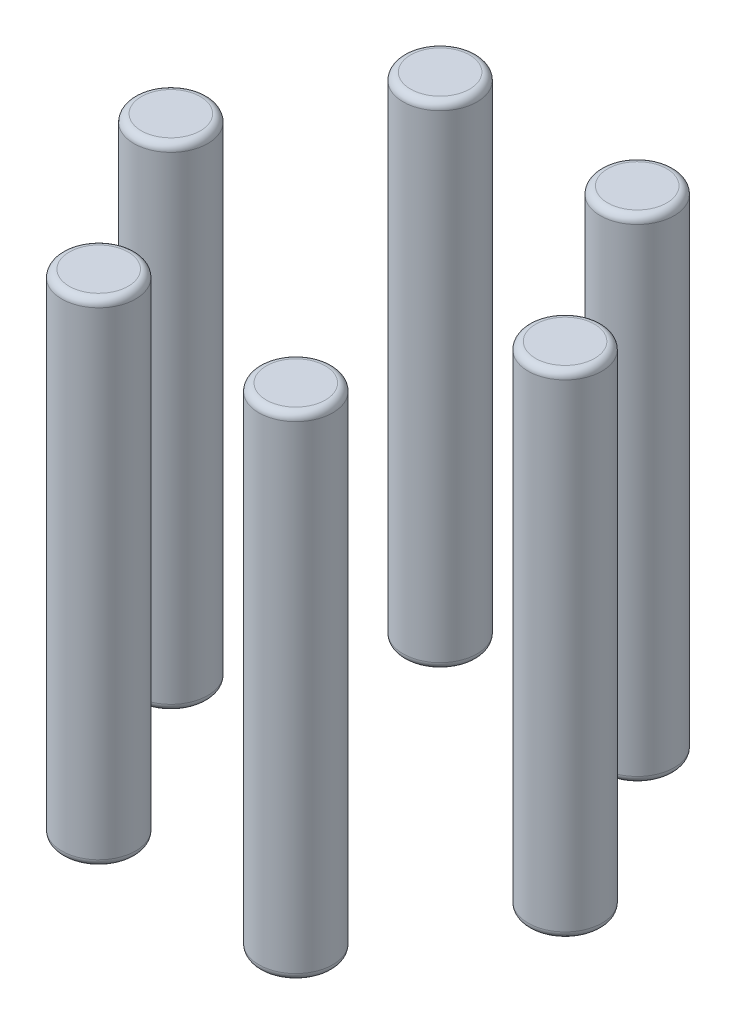
ISO-10303-21;
HEADER;
FILE_DESCRIPTION(('STEP AP214'),'2;1');
FILE_NAME('part.step','',(''),(''),'','','');
FILE_SCHEMA(('AUTOMOTIVE_DESIGN { 1 0 10303 214 1 1 1 1 }'));
ENDSEC;
DATA;
#1=APPLICATION_CONTEXT('core data for automotive mechanical design processes');
#2=APPLICATION_PROTOCOL_DEFINITION('international standard','automotive_design',2000,#1);
#3=PRODUCT_CONTEXT('',#1,'mechanical');
#4=PRODUCT('Part','Part','',(#3));
#5=PRODUCT_RELATED_PRODUCT_CATEGORY('part','',(#4));
#6=PRODUCT_DEFINITION_FORMATION('','',#4);
#7=PRODUCT_DEFINITION_CONTEXT('part definition',#1,'design');
#8=PRODUCT_DEFINITION('design','',#6,#7);
#9=PRODUCT_DEFINITION_SHAPE('','',#8);
#10=(LENGTH_UNIT() NAMED_UNIT(*) SI_UNIT(.MILLI.,.METRE.));
#11=(NAMED_UNIT(*) PLANE_ANGLE_UNIT() SI_UNIT($,.RADIAN.));
#12=(NAMED_UNIT(*) SI_UNIT($,.STERADIAN.) SOLID_ANGLE_UNIT());
#13=UNCERTAINTY_MEASURE_WITH_UNIT(LENGTH_MEASURE(1.E-05),#10,'distance_accuracy_value','');
#14=(GEOMETRIC_REPRESENTATION_CONTEXT(3) GLOBAL_UNCERTAINTY_ASSIGNED_CONTEXT((#13)) GLOBAL_UNIT_ASSIGNED_CONTEXT((#10,
#11,#12)) REPRESENTATION_CONTEXT('',''));
#15=CARTESIAN_POINT('',(0.,0.,0.));
#16=DIRECTION('',(0.,0.,1.));
#17=DIRECTION('',(1.,0.,0.));
#18=AXIS2_PLACEMENT_3D('',#15,#16,#17);
#19=CARTESIAN_POINT('',(3.5,-6.,-6.92820334332935));
#20=DIRECTION('',(0.,1.,0.));
#21=DIRECTION('',(0.,0.,1.));
#22=AXIS2_PLACEMENT_3D('',#19,#20,#21);
#23=CYLINDRICAL_SURFACE('',#22,1.5);
#24=CARTESIAN_POINT('',(3.5,-5.7,-6.92820334332935));
#25=DIRECTION('',(0.,1.,0.));
#26=DIRECTION('',(0.,0.,1.));
#27=AXIS2_PLACEMENT_3D('',#24,#25,#26);
#28=CIRCLE('',#27,1.5);
#29=CARTESIAN_POINT('',(3.5,-5.7,-5.42820334332935));
#30=VERTEX_POINT('',#29);
#31=EDGE_CURVE('E52',#30,#30,#28,.T.);
#32=ORIENTED_EDGE('',*,*,#31,.T.);
#33=EDGE_LOOP('',(#32));
#34=FACE_BOUND('',#33,.T.);
#35=CARTESIAN_POINT('',(3.5,13.7,-6.92820334332935));
#36=DIRECTION('',(0.,1.,0.));
#37=DIRECTION('',(0.,0.,1.));
#38=AXIS2_PLACEMENT_3D('',#35,#36,#37);
#39=CIRCLE('',#38,1.5);
#40=CARTESIAN_POINT('',(3.5,13.7,-5.42820334332935));
#41=VERTEX_POINT('',#40);
#42=EDGE_CURVE('E60',#41,#41,#39,.F.);
#43=ORIENTED_EDGE('',*,*,#42,.T.);
#44=EDGE_LOOP('',(#43));
#45=FACE_BOUND('',#44,.T.);
#46=ADVANCED_FACE('F46',(#34,#45),#23,.T.);
#47=CARTESIAN_POINT('',(3.5,-6.,-6.92820334332935));
#48=DIRECTION('',(0.,1.,0.));
#49=DIRECTION('',(0.,0.,1.));
#50=AXIS2_PLACEMENT_3D('',#47,#48,#49);
#51=PLANE('',#50);
#52=CARTESIAN_POINT('',(3.5,-6.,-6.92820334332935));
#53=DIRECTION('',(0.,1.,0.));
#54=DIRECTION('',(0.,0.,1.));
#55=AXIS2_PLACEMENT_3D('',#52,#53,#54);
#56=CIRCLE('',#55,1.2);
#57=CARTESIAN_POINT('',(3.5,-6.,-5.72820334332935));
#58=VERTEX_POINT('',#57);
#59=EDGE_CURVE('E11',#58,#58,#56,.F.);
#60=ORIENTED_EDGE('',*,*,#59,.T.);
#61=EDGE_LOOP('',(#60));
#62=FACE_BOUND('',#61,.T.);
#63=ADVANCED_FACE('F76',(#62),#51,.F.);
#64=CARTESIAN_POINT('',(3.5,14.,-6.92820334332935));
#65=DIRECTION('',(0.,1.,0.));
#66=DIRECTION('',(0.,0.,1.));
#67=AXIS2_PLACEMENT_3D('',#64,#65,#66);
#68=PLANE('',#67);
#69=CARTESIAN_POINT('',(3.5,14.,-6.92820334332935));
#70=DIRECTION('',(0.,1.,0.));
#71=DIRECTION('',(0.,0.,1.));
#72=AXIS2_PLACEMENT_3D('',#69,#70,#71);
#73=CIRCLE('',#72,1.2);
#74=CARTESIAN_POINT('',(3.5,14.,-5.72820334332935));
#75=VERTEX_POINT('',#74);
#76=EDGE_CURVE('E62',#75,#75,#73,.T.);
#77=ORIENTED_EDGE('',*,*,#76,.T.);
#78=EDGE_LOOP('',(#77));
#79=FACE_BOUND('',#78,.T.);
#80=ADVANCED_FACE('F70',(#79),#68,.T.);
#81=CARTESIAN_POINT('',(3.5,13.7,-6.92820334332935));
#82=DIRECTION('',(0.,1.,0.));
#83=DIRECTION('',(0.,0.,1.));
#84=AXIS2_PLACEMENT_3D('',#81,#82,#83);
#85=TOROIDAL_SURFACE('',#84,1.2,0.3);
#86=ORIENTED_EDGE('',*,*,#42,.F.);
#87=EDGE_LOOP('',(#86));
#88=FACE_BOUND('',#87,.T.);
#89=ORIENTED_EDGE('',*,*,#76,.F.);
#90=EDGE_LOOP('',(#89));
#91=FACE_BOUND('',#90,.T.);
#92=ADVANCED_FACE('F66',(#88,#91),#85,.T.);
#93=CARTESIAN_POINT('',(3.5,-5.7,-6.92820334332935));
#94=DIRECTION('',(0.,1.,0.));
#95=DIRECTION('',(0.,0.,1.));
#96=AXIS2_PLACEMENT_3D('',#93,#94,#95);
#97=TOROIDAL_SURFACE('',#96,1.2,0.3);
#98=ORIENTED_EDGE('',*,*,#59,.F.);
#99=EDGE_LOOP('',(#98));
#100=FACE_BOUND('',#99,.T.);
#101=ORIENTED_EDGE('',*,*,#31,.F.);
#102=EDGE_LOOP('',(#101));
#103=FACE_BOUND('',#102,.T.);
#104=ADVANCED_FACE('F48',(#100,#103),#97,.T.);
#105=CLOSED_SHELL('',(#46,#63,#80,#92,#104));
#106=MANIFOLD_SOLID_BREP('B2',#105);
#107=CARTESIAN_POINT('',(-4.5,-6.,-6.92820334332935));
#108=DIRECTION('',(0.,1.,0.));
#109=DIRECTION('',(0.,0.,1.));
#110=AXIS2_PLACEMENT_3D('',#107,#108,#109);
#111=CYLINDRICAL_SURFACE('',#110,1.5);
#112=CARTESIAN_POINT('',(-4.5,-5.7,-6.92820334332935));
#113=DIRECTION('',(0.,1.,0.));
#114=DIRECTION('',(0.,0.,1.));
#115=AXIS2_PLACEMENT_3D('',#112,#113,#114);
#116=CIRCLE('',#115,1.5);
#117=CARTESIAN_POINT('',(-4.5,-5.7,-5.42820334332935));
#118=VERTEX_POINT('',#117);
#119=EDGE_CURVE('E135',#118,#118,#116,.T.);
#120=ORIENTED_EDGE('',*,*,#119,.T.);
#121=EDGE_LOOP('',(#120));
#122=FACE_BOUND('',#121,.T.);
#123=CARTESIAN_POINT('',(-4.5,13.7,-6.92820334332935));
#124=DIRECTION('',(0.,1.,0.));
#125=DIRECTION('',(0.,0.,1.));
#126=AXIS2_PLACEMENT_3D('',#123,#124,#125);
#127=CIRCLE('',#126,1.5);
#128=CARTESIAN_POINT('',(-4.5,13.7,-5.42820334332935));
#129=VERTEX_POINT('',#128);
#130=EDGE_CURVE('E136',#129,#129,#127,.F.);
#131=ORIENTED_EDGE('',*,*,#130,.T.);
#132=EDGE_LOOP('',(#131));
#133=FACE_BOUND('',#132,.T.);
#134=ADVANCED_FACE('F123',(#122,#133),#111,.T.);
#135=CARTESIAN_POINT('',(-4.5,-6.,-6.92820334332935));
#136=DIRECTION('',(0.,1.,0.));
#137=DIRECTION('',(0.,0.,1.));
#138=AXIS2_PLACEMENT_3D('',#135,#136,#137);
#139=PLANE('',#138);
#140=CARTESIAN_POINT('',(-4.5,-6.,-6.92820334332935));
#141=DIRECTION('',(0.,1.,0.));
#142=DIRECTION('',(0.,0.,1.));
#143=AXIS2_PLACEMENT_3D('',#140,#141,#142);
#144=CIRCLE('',#143,1.2);
#145=CARTESIAN_POINT('',(-4.5,-6.,-5.72820334332935));
#146=VERTEX_POINT('',#145);
#147=EDGE_CURVE('E44',#146,#146,#144,.F.);
#148=ORIENTED_EDGE('',*,*,#147,.T.);
#149=EDGE_LOOP('',(#148));
#150=FACE_BOUND('',#149,.T.);
#151=ADVANCED_FACE('F157',(#150),#139,.F.);
#152=CARTESIAN_POINT('',(-4.5,14.,-6.92820334332935));
#153=DIRECTION('',(0.,1.,0.));
#154=DIRECTION('',(0.,0.,1.));
#155=AXIS2_PLACEMENT_3D('',#152,#153,#154);
#156=PLANE('',#155);
#157=CARTESIAN_POINT('',(-4.5,14.,-6.92820334332935));
#158=DIRECTION('',(0.,1.,0.));
#159=DIRECTION('',(0.,0.,1.));
#160=AXIS2_PLACEMENT_3D('',#157,#158,#159);
#161=CIRCLE('',#160,1.2);
#162=CARTESIAN_POINT('',(-4.5,14.,-5.72820334332935));
#163=VERTEX_POINT('',#162);
#164=EDGE_CURVE('E140',#163,#163,#161,.T.);
#165=ORIENTED_EDGE('',*,*,#164,.T.);
#166=EDGE_LOOP('',(#165));
#167=FACE_BOUND('',#166,.T.);
#168=ADVANCED_FACE('F147',(#167),#156,.T.);
#169=CARTESIAN_POINT('',(-4.5,13.7,-6.92820334332935));
#170=DIRECTION('',(0.,1.,0.));
#171=DIRECTION('',(0.,0.,1.));
#172=AXIS2_PLACEMENT_3D('',#169,#170,#171);
#173=TOROIDAL_SURFACE('',#172,1.2,0.3);
#174=ORIENTED_EDGE('',*,*,#130,.F.);
#175=EDGE_LOOP('',(#174));
#176=FACE_BOUND('',#175,.T.);
#177=ORIENTED_EDGE('',*,*,#164,.F.);
#178=EDGE_LOOP('',(#177));
#179=FACE_BOUND('',#178,.T.);
#180=ADVANCED_FACE('F149',(#176,#179),#173,.T.);
#181=CARTESIAN_POINT('',(-4.5,-5.7,-6.92820334332935));
#182=DIRECTION('',(0.,1.,0.));
#183=DIRECTION('',(0.,0.,1.));
#184=AXIS2_PLACEMENT_3D('',#181,#182,#183);
#185=TOROIDAL_SURFACE('',#184,1.2,0.3);
#186=ORIENTED_EDGE('',*,*,#147,.F.);
#187=EDGE_LOOP('',(#186));
#188=FACE_BOUND('',#187,.T.);
#189=ORIENTED_EDGE('',*,*,#119,.F.);
#190=EDGE_LOOP('',(#189));
#191=FACE_BOUND('',#190,.T.);
#192=ADVANCED_FACE('F130',(#188,#191),#185,.T.);
#193=CLOSED_SHELL('',(#134,#151,#168,#180,#192));
#194=MANIFOLD_SOLID_BREP('B6',#193);
#195=CARTESIAN_POINT('',(-8.5,-6.,-1.13053841672625E-07));
#196=DIRECTION('',(0.,1.,0.));
#197=DIRECTION('',(0.,0.,1.));
#198=AXIS2_PLACEMENT_3D('',#195,#196,#197);
#199=CYLINDRICAL_SURFACE('',#198,1.5);
#200=CARTESIAN_POINT('',(-8.5,-5.7,-1.13053841672625E-07));
#201=DIRECTION('',(0.,1.,0.));
#202=DIRECTION('',(0.,0.,1.));
#203=AXIS2_PLACEMENT_3D('',#200,#201,#202);
#204=CIRCLE('',#203,1.5);
#205=CARTESIAN_POINT('',(-8.5,-5.7,1.49999988694616));
#206=VERTEX_POINT('',#205);
#207=EDGE_CURVE('E212',#206,#206,#204,.T.);
#208=ORIENTED_EDGE('',*,*,#207,.T.);
#209=EDGE_LOOP('',(#208));
#210=FACE_BOUND('',#209,.T.);
#211=CARTESIAN_POINT('',(-8.5,13.7,-1.13053841672625E-07));
#212=DIRECTION('',(0.,1.,0.));
#213=DIRECTION('',(0.,0.,1.));
#214=AXIS2_PLACEMENT_3D('',#211,#212,#213);
#215=CIRCLE('',#214,1.5);
#216=CARTESIAN_POINT('',(-8.5,13.7,1.49999988694616));
#217=VERTEX_POINT('',#216);
#218=EDGE_CURVE('E213',#217,#217,#215,.F.);
#219=ORIENTED_EDGE('',*,*,#218,.T.);
#220=EDGE_LOOP('',(#219));
#221=FACE_BOUND('',#220,.T.);
#222=ADVANCED_FACE('F203',(#210,#221),#199,.T.);
#223=CARTESIAN_POINT('',(-8.5,-6.,-1.13053841672625E-07));
#224=DIRECTION('',(0.,1.,0.));
#225=DIRECTION('',(0.,0.,1.));
#226=AXIS2_PLACEMENT_3D('',#223,#224,#225);
#227=PLANE('',#226);
#228=CARTESIAN_POINT('',(-8.5,-6.,-1.13053841672625E-07));
#229=DIRECTION('',(0.,1.,0.));
#230=DIRECTION('',(0.,0.,1.));
#231=AXIS2_PLACEMENT_3D('',#228,#229,#230);
#232=CIRCLE('',#231,1.2);
#233=CARTESIAN_POINT('',(-8.5,-6.,1.19999988694616));
#234=VERTEX_POINT('',#233);
#235=EDGE_CURVE('E121',#234,#234,#232,.F.);
#236=ORIENTED_EDGE('',*,*,#235,.T.);
#237=EDGE_LOOP('',(#236));
#238=FACE_BOUND('',#237,.T.);
#239=ADVANCED_FACE('F236',(#238),#227,.F.);
#240=CARTESIAN_POINT('',(-8.5,14.,-1.13053841672625E-07));
#241=DIRECTION('',(0.,1.,0.));
#242=DIRECTION('',(0.,0.,1.));
#243=AXIS2_PLACEMENT_3D('',#240,#241,#242);
#244=PLANE('',#243);
#245=CARTESIAN_POINT('',(-8.5,14.,-1.13053841672625E-07));
#246=DIRECTION('',(0.,1.,0.));
#247=DIRECTION('',(0.,0.,1.));
#248=AXIS2_PLACEMENT_3D('',#245,#246,#247);
#249=CIRCLE('',#248,1.2);
#250=CARTESIAN_POINT('',(-8.5,14.,1.19999988694616));
#251=VERTEX_POINT('',#250);
#252=EDGE_CURVE('E216',#251,#251,#249,.T.);
#253=ORIENTED_EDGE('',*,*,#252,.T.);
#254=EDGE_LOOP('',(#253));
#255=FACE_BOUND('',#254,.T.);
#256=ADVANCED_FACE('F225',(#255),#244,.T.);
#257=CARTESIAN_POINT('',(-8.5,13.7,-1.13053841672625E-07));
#258=DIRECTION('',(0.,1.,0.));
#259=DIRECTION('',(0.,0.,1.));
#260=AXIS2_PLACEMENT_3D('',#257,#258,#259);
#261=TOROIDAL_SURFACE('',#260,1.2,0.3);
#262=ORIENTED_EDGE('',*,*,#218,.F.);
#263=EDGE_LOOP('',(#262));
#264=FACE_BOUND('',#263,.T.);
#265=ORIENTED_EDGE('',*,*,#252,.F.);
#266=EDGE_LOOP('',(#265));
#267=FACE_BOUND('',#266,.T.);
#268=ADVANCED_FACE('F227',(#264,#267),#261,.T.);
#269=CARTESIAN_POINT('',(-8.5,-5.7,-1.13053841672625E-07));
#270=DIRECTION('',(0.,1.,0.));
#271=DIRECTION('',(0.,0.,1.));
#272=AXIS2_PLACEMENT_3D('',#269,#270,#271);
#273=TOROIDAL_SURFACE('',#272,1.2,0.3);
#274=ORIENTED_EDGE('',*,*,#235,.F.);
#275=EDGE_LOOP('',(#274));
#276=FACE_BOUND('',#275,.T.);
#277=ORIENTED_EDGE('',*,*,#207,.F.);
#278=EDGE_LOOP('',(#277));
#279=FACE_BOUND('',#278,.T.);
#280=ADVANCED_FACE('F207',(#276,#279),#273,.T.);
#281=CLOSED_SHELL('',(#222,#239,#256,#268,#280));
#282=MANIFOLD_SOLID_BREP('B37',#281);
#283=CARTESIAN_POINT('',(-4.5,-6.,6.92820311722167));
#284=DIRECTION('',(0.,1.,0.));
#285=DIRECTION('',(0.,0.,1.));
#286=AXIS2_PLACEMENT_3D('',#283,#284,#285);
#287=CYLINDRICAL_SURFACE('',#286,1.5);
#288=CARTESIAN_POINT('',(-4.5,-5.7,6.92820311722167));
#289=DIRECTION('',(0.,1.,0.));
#290=DIRECTION('',(0.,0.,1.));
#291=AXIS2_PLACEMENT_3D('',#288,#289,#290);
#292=CIRCLE('',#291,1.5);
#293=CARTESIAN_POINT('',(-4.5,-5.7,8.42820311722167));
#294=VERTEX_POINT('',#293);
#295=EDGE_CURVE('E290',#294,#294,#292,.T.);
#296=ORIENTED_EDGE('',*,*,#295,.T.);
#297=EDGE_LOOP('',(#296));
#298=FACE_BOUND('',#297,.T.);
#299=CARTESIAN_POINT('',(-4.5,13.7,6.92820311722167));
#300=DIRECTION('',(0.,1.,0.));
#301=DIRECTION('',(0.,0.,1.));
#302=AXIS2_PLACEMENT_3D('',#299,#300,#301);
#303=CIRCLE('',#302,1.5);
#304=CARTESIAN_POINT('',(-4.5,13.7,8.42820311722167));
#305=VERTEX_POINT('',#304);
#306=EDGE_CURVE('E295',#305,#305,#303,.F.);
#307=ORIENTED_EDGE('',*,*,#306,.T.);
#308=EDGE_LOOP('',(#307));
#309=FACE_BOUND('',#308,.T.);
#310=ADVANCED_FACE('F284',(#298,#309),#287,.T.);
#311=CARTESIAN_POINT('',(-4.5,-6.,6.92820311722167));
#312=DIRECTION('',(0.,1.,0.));
#313=DIRECTION('',(0.,0.,1.));
#314=AXIS2_PLACEMENT_3D('',#311,#312,#313);
#315=PLANE('',#314);
#316=CARTESIAN_POINT('',(-4.5,-6.,6.92820311722167));
#317=DIRECTION('',(0.,1.,0.));
#318=DIRECTION('',(0.,0.,1.));
#319=AXIS2_PLACEMENT_3D('',#316,#317,#318);
#320=CIRCLE('',#319,1.2);
#321=CARTESIAN_POINT('',(-4.5,-6.,8.12820311722167));
#322=VERTEX_POINT('',#321);
#323=EDGE_CURVE('E204',#322,#322,#320,.F.);
#324=ORIENTED_EDGE('',*,*,#323,.T.);
#325=EDGE_LOOP('',(#324));
#326=FACE_BOUND('',#325,.T.);
#327=ADVANCED_FACE('F314',(#326),#315,.F.);
#328=CARTESIAN_POINT('',(-4.5,14.,6.92820311722167));
#329=DIRECTION('',(0.,1.,0.));
#330=DIRECTION('',(0.,0.,1.));
#331=AXIS2_PLACEMENT_3D('',#328,#329,#330);
#332=PLANE('',#331);
#333=CARTESIAN_POINT('',(-4.5,14.,6.92820311722167));
#334=DIRECTION('',(0.,1.,0.));
#335=DIRECTION('',(0.,0.,1.));
#336=AXIS2_PLACEMENT_3D('',#333,#334,#335);
#337=CIRCLE('',#336,1.2);
#338=CARTESIAN_POINT('',(-4.5,14.,8.12820311722167));
#339=VERTEX_POINT('',#338);
#340=EDGE_CURVE('E296',#339,#339,#337,.T.);
#341=ORIENTED_EDGE('',*,*,#340,.T.);
#342=EDGE_LOOP('',(#341));
#343=FACE_BOUND('',#342,.T.);
#344=ADVANCED_FACE('F302',(#343),#332,.T.);
#345=CARTESIAN_POINT('',(-4.5,13.7,6.92820311722167));
#346=DIRECTION('',(0.,1.,0.));
#347=DIRECTION('',(0.,0.,1.));
#348=AXIS2_PLACEMENT_3D('',#345,#346,#347);
#349=TOROIDAL_SURFACE('',#348,1.2,0.3);
#350=ORIENTED_EDGE('',*,*,#306,.F.);
#351=EDGE_LOOP('',(#350));
#352=FACE_BOUND('',#351,.T.);
#353=ORIENTED_EDGE('',*,*,#340,.F.);
#354=EDGE_LOOP('',(#353));
#355=FACE_BOUND('',#354,.T.);
#356=ADVANCED_FACE('F306',(#352,#355),#349,.T.);
#357=CARTESIAN_POINT('',(-4.5,-5.7,6.92820311722167));
#358=DIRECTION('',(0.,1.,0.));
#359=DIRECTION('',(0.,0.,1.));
#360=AXIS2_PLACEMENT_3D('',#357,#358,#359);
#361=TOROIDAL_SURFACE('',#360,1.2,0.3);
#362=ORIENTED_EDGE('',*,*,#323,.F.);
#363=EDGE_LOOP('',(#362));
#364=FACE_BOUND('',#363,.T.);
#365=ORIENTED_EDGE('',*,*,#295,.F.);
#366=EDGE_LOOP('',(#365));
#367=FACE_BOUND('',#366,.T.);
#368=ADVANCED_FACE('F283',(#364,#367),#361,.T.);
#369=CLOSED_SHELL('',(#310,#327,#344,#356,#368));
#370=MANIFOLD_SOLID_BREP('B118',#369);
#371=CARTESIAN_POINT('',(3.5,-6.,6.92820311722167));
#372=DIRECTION('',(0.,1.,0.));
#373=DIRECTION('',(0.,0.,1.));
#374=AXIS2_PLACEMENT_3D('',#371,#372,#373);
#375=CYLINDRICAL_SURFACE('',#374,1.5);
#376=CARTESIAN_POINT('',(3.5,-5.7,6.92820311722167));
#377=DIRECTION('',(0.,1.,0.));
#378=DIRECTION('',(0.,0.,1.));
#379=AXIS2_PLACEMENT_3D('',#376,#377,#378);
#380=CIRCLE('',#379,1.5);
#381=CARTESIAN_POINT('',(3.5,-5.7,8.42820311722167));
#382=VERTEX_POINT('',#381);
#383=EDGE_CURVE('E368',#382,#382,#380,.T.);
#384=ORIENTED_EDGE('',*,*,#383,.T.);
#385=EDGE_LOOP('',(#384));
#386=FACE_BOUND('',#385,.T.);
#387=CARTESIAN_POINT('',(3.5,13.7,6.92820311722167));
#388=DIRECTION('',(0.,1.,0.));
#389=DIRECTION('',(0.,0.,1.));
#390=AXIS2_PLACEMENT_3D('',#387,#388,#389);
#391=CIRCLE('',#390,1.5);
#392=CARTESIAN_POINT('',(3.5,13.7,8.42820311722167));
#393=VERTEX_POINT('',#392);
#394=EDGE_CURVE('E375',#393,#393,#391,.F.);
#395=ORIENTED_EDGE('',*,*,#394,.T.);
#396=EDGE_LOOP('',(#395));
#397=FACE_BOUND('',#396,.T.);
#398=ADVANCED_FACE('F363',(#386,#397),#375,.T.);
#399=CARTESIAN_POINT('',(3.5,-6.,6.92820311722167));
#400=DIRECTION('',(0.,1.,0.));
#401=DIRECTION('',(0.,0.,1.));
#402=AXIS2_PLACEMENT_3D('',#399,#400,#401);
#403=PLANE('',#402);
#404=CARTESIAN_POINT('',(3.5,-6.,6.92820311722167));
#405=DIRECTION('',(0.,1.,0.));
#406=DIRECTION('',(0.,0.,1.));
#407=AXIS2_PLACEMENT_3D('',#404,#405,#406);
#408=CIRCLE('',#407,1.2);
#409=CARTESIAN_POINT('',(3.5,-6.,8.12820311722166));
#410=VERTEX_POINT('',#409);
#411=EDGE_CURVE('E285',#410,#410,#408,.F.);
#412=ORIENTED_EDGE('',*,*,#411,.T.);
#413=EDGE_LOOP('',(#412));
#414=FACE_BOUND('',#413,.T.);
#415=ADVANCED_FACE('F394',(#414),#403,.F.);
#416=CARTESIAN_POINT('',(3.5,14.,6.92820311722167));
#417=DIRECTION('',(0.,1.,0.));
#418=DIRECTION('',(0.,0.,1.));
#419=AXIS2_PLACEMENT_3D('',#416,#417,#418);
#420=PLANE('',#419);
#421=CARTESIAN_POINT('',(3.5,14.,6.92820311722167));
#422=DIRECTION('',(0.,1.,0.));
#423=DIRECTION('',(0.,0.,1.));
#424=AXIS2_PLACEMENT_3D('',#421,#422,#423);
#425=CIRCLE('',#424,1.2);
#426=CARTESIAN_POINT('',(3.5,14.,8.12820311722166));
#427=VERTEX_POINT('',#426);
#428=EDGE_CURVE('E376',#427,#427,#425,.T.);
#429=ORIENTED_EDGE('',*,*,#428,.T.);
#430=EDGE_LOOP('',(#429));
#431=FACE_BOUND('',#430,.T.);
#432=ADVANCED_FACE('F385',(#431),#420,.T.);
#433=CARTESIAN_POINT('',(3.5,13.7,6.92820311722167));
#434=DIRECTION('',(0.,1.,0.));
#435=DIRECTION('',(0.,0.,1.));
#436=AXIS2_PLACEMENT_3D('',#433,#434,#435);
#437=TOROIDAL_SURFACE('',#436,1.2,0.3);
#438=ORIENTED_EDGE('',*,*,#394,.F.);
#439=EDGE_LOOP('',(#438));
#440=FACE_BOUND('',#439,.T.);
#441=ORIENTED_EDGE('',*,*,#428,.F.);
#442=EDGE_LOOP('',(#441));
#443=FACE_BOUND('',#442,.T.);
#444=ADVANCED_FACE('F381',(#440,#443),#437,.T.);
#445=CARTESIAN_POINT('',(3.5,-5.7,6.92820311722167));
#446=DIRECTION('',(0.,1.,0.));
#447=DIRECTION('',(0.,0.,1.));
#448=AXIS2_PLACEMENT_3D('',#445,#446,#447);
#449=TOROIDAL_SURFACE('',#448,1.2,0.3);
#450=ORIENTED_EDGE('',*,*,#411,.F.);
#451=EDGE_LOOP('',(#450));
#452=FACE_BOUND('',#451,.T.);
#453=ORIENTED_EDGE('',*,*,#383,.F.);
#454=EDGE_LOOP('',(#453));
#455=FACE_BOUND('',#454,.T.);
#456=ADVANCED_FACE('F361',(#452,#455),#449,.T.);
#457=CLOSED_SHELL('',(#398,#415,#432,#444,#456));
#458=MANIFOLD_SOLID_BREP('B199',#457);
#459=CARTESIAN_POINT('',(7.5,-6.,-1.13053842713575E-07));
#460=DIRECTION('',(0.,1.,0.));
#461=DIRECTION('',(0.,0.,1.));
#462=AXIS2_PLACEMENT_3D('',#459,#460,#461);
#463=CYLINDRICAL_SURFACE('',#462,1.5);
#464=CARTESIAN_POINT('',(7.5,-5.7,-1.13053842713575E-07));
#465=DIRECTION('',(0.,1.,0.));
#466=DIRECTION('',(0.,0.,1.));
#467=AXIS2_PLACEMENT_3D('',#464,#465,#466);
#468=CIRCLE('',#467,1.5);
#469=CARTESIAN_POINT('',(7.5,-5.7,1.49999988694616));
#470=VERTEX_POINT('',#469);
#471=EDGE_CURVE('E437',#470,#470,#468,.T.);
#472=ORIENTED_EDGE('',*,*,#471,.T.);
#473=EDGE_LOOP('',(#472));
#474=FACE_BOUND('',#473,.T.);
#475=CARTESIAN_POINT('',(7.5,13.7,-1.13053842713575E-07));
#476=DIRECTION('',(0.,1.,0.));
#477=DIRECTION('',(0.,0.,1.));
#478=AXIS2_PLACEMENT_3D('',#475,#476,#477);
#479=CIRCLE('',#478,1.5);
#480=CARTESIAN_POINT('',(7.5,13.7,1.49999988694616));
#481=VERTEX_POINT('',#480);
#482=EDGE_CURVE('E442',#481,#481,#479,.F.);
#483=ORIENTED_EDGE('',*,*,#482,.T.);
#484=EDGE_LOOP('',(#483));
#485=FACE_BOUND('',#484,.T.);
#486=ADVANCED_FACE('F435',(#474,#485),#463,.T.);
#487=CARTESIAN_POINT('',(7.5,-6.,-1.13053842713575E-07));
#488=DIRECTION('',(0.,1.,0.));
#489=DIRECTION('',(0.,0.,1.));
#490=AXIS2_PLACEMENT_3D('',#487,#488,#489);
#491=PLANE('',#490);
#492=CARTESIAN_POINT('',(7.5,-6.,-1.13053842713575E-07));
#493=DIRECTION('',(0.,1.,0.));
#494=DIRECTION('',(0.,0.,1.));
#495=AXIS2_PLACEMENT_3D('',#492,#493,#494);
#496=CIRCLE('',#495,1.2);
#497=CARTESIAN_POINT('',(7.5,-6.,1.19999988694616));
#498=VERTEX_POINT('',#497);
#499=EDGE_CURVE('E359',#498,#498,#496,.F.);
#500=ORIENTED_EDGE('',*,*,#499,.T.);
#501=EDGE_LOOP('',(#500));
#502=FACE_BOUND('',#501,.T.);
#503=ADVANCED_FACE('F463',(#502),#491,.F.);
#504=CARTESIAN_POINT('',(7.5,14.,-1.13053842713575E-07));
#505=DIRECTION('',(0.,1.,0.));
#506=DIRECTION('',(0.,0.,1.));
#507=AXIS2_PLACEMENT_3D('',#504,#505,#506);
#508=PLANE('',#507);
#509=CARTESIAN_POINT('',(7.5,14.,-1.13053842713575E-07));
#510=DIRECTION('',(0.,1.,0.));
#511=DIRECTION('',(0.,0.,1.));
#512=AXIS2_PLACEMENT_3D('',#509,#510,#511);
#513=CIRCLE('',#512,1.2);
#514=CARTESIAN_POINT('',(7.5,14.,1.19999988694616));
#515=VERTEX_POINT('',#514);
#516=EDGE_CURVE('E450',#515,#515,#513,.T.);
#517=ORIENTED_EDGE('',*,*,#516,.T.);
#518=EDGE_LOOP('',(#517));
#519=FACE_BOUND('',#518,.T.);
#520=ADVANCED_FACE('F454',(#519),#508,.T.);
#521=CARTESIAN_POINT('',(7.5,13.7,-1.13053842713575E-07));
#522=DIRECTION('',(0.,1.,0.));
#523=DIRECTION('',(0.,0.,1.));
#524=AXIS2_PLACEMENT_3D('',#521,#522,#523);
#525=TOROIDAL_SURFACE('',#524,1.2,0.3);
#526=ORIENTED_EDGE('',*,*,#482,.F.);
#527=EDGE_LOOP('',(#526));
#528=FACE_BOUND('',#527,.T.);
#529=ORIENTED_EDGE('',*,*,#516,.F.);
#530=EDGE_LOOP('',(#529));
#531=FACE_BOUND('',#530,.T.);
#532=ADVANCED_FACE('F453',(#528,#531),#525,.T.);
#533=CARTESIAN_POINT('',(7.5,-5.7,-1.13053842713575E-07));
#534=DIRECTION('',(0.,1.,0.));
#535=DIRECTION('',(0.,0.,1.));
#536=AXIS2_PLACEMENT_3D('',#533,#534,#535);
#537=TOROIDAL_SURFACE('',#536,1.2,0.3);
#538=ORIENTED_EDGE('',*,*,#499,.F.);
#539=EDGE_LOOP('',(#538));
#540=FACE_BOUND('',#539,.T.);
#541=ORIENTED_EDGE('',*,*,#471,.F.);
#542=EDGE_LOOP('',(#541));
#543=FACE_BOUND('',#542,.T.);
#544=ADVANCED_FACE('F432',(#540,#543),#537,.T.);
#545=CLOSED_SHELL('',(#486,#503,#520,#532,#544));
#546=MANIFOLD_SOLID_BREP('B280',#545);
#547=ADVANCED_BREP_SHAPE_REPRESENTATION('',(#18,#106,#194,#282,#370,#458,#546),#14);
#548=SHAPE_DEFINITION_REPRESENTATION(#9,#547);
ENDSEC;
END-ISO-10303-21;
